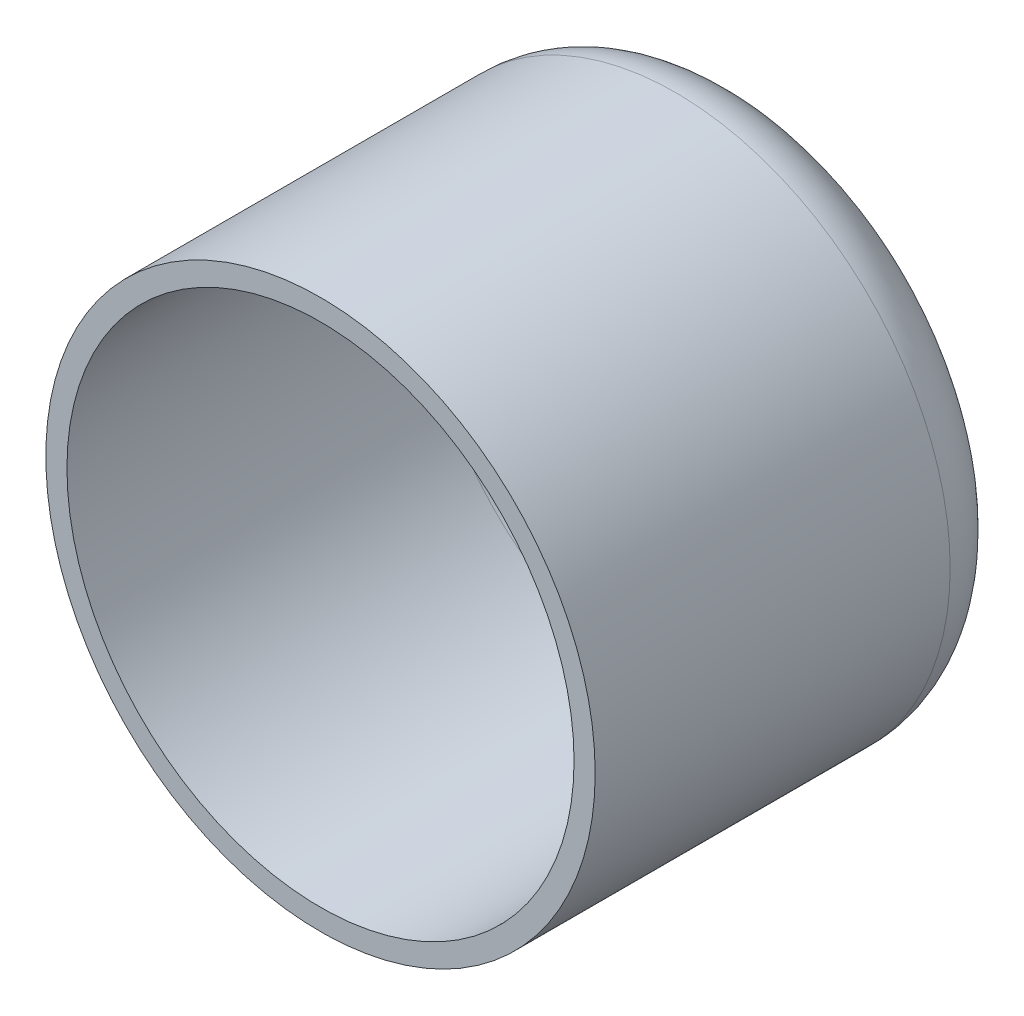
ISO-10303-21;
HEADER;
FILE_DESCRIPTION(('STEP AP214'),'2;1');
FILE_NAME('part.step','',(''),(''),'','','');
FILE_SCHEMA(('AUTOMOTIVE_DESIGN { 1 0 10303 214 1 1 1 1 }'));
ENDSEC;
DATA;
#1=APPLICATION_CONTEXT('core data for automotive mechanical design processes');
#2=APPLICATION_PROTOCOL_DEFINITION('international standard','automotive_design',2000,#1);
#3=PRODUCT_CONTEXT('',#1,'mechanical');
#4=PRODUCT('Part','Part','',(#3));
#5=PRODUCT_RELATED_PRODUCT_CATEGORY('part','',(#4));
#6=PRODUCT_DEFINITION_FORMATION('','',#4);
#7=PRODUCT_DEFINITION_CONTEXT('part definition',#1,'design');
#8=PRODUCT_DEFINITION('design','',#6,#7);
#9=PRODUCT_DEFINITION_SHAPE('','',#8);
#10=(LENGTH_UNIT() NAMED_UNIT(*) SI_UNIT(.MILLI.,.METRE.));
#11=(NAMED_UNIT(*) PLANE_ANGLE_UNIT() SI_UNIT($,.RADIAN.));
#12=(NAMED_UNIT(*) SI_UNIT($,.STERADIAN.) SOLID_ANGLE_UNIT());
#13=UNCERTAINTY_MEASURE_WITH_UNIT(LENGTH_MEASURE(1.E-05),#10,'distance_accuracy_value','');
#14=(GEOMETRIC_REPRESENTATION_CONTEXT(3) GLOBAL_UNCERTAINTY_ASSIGNED_CONTEXT((#13)) GLOBAL_UNIT_ASSIGNED_CONTEXT((#10,
#11,#12)) REPRESENTATION_CONTEXT('',''));
#15=CARTESIAN_POINT('',(0.,0.,0.));
#16=DIRECTION('',(0.,0.,1.));
#17=DIRECTION('',(1.,0.,0.));
#18=AXIS2_PLACEMENT_3D('',#15,#16,#17);
#19=CARTESIAN_POINT('',(0.,0.,15.875));
#20=DIRECTION('',(0.,0.,-1.));
#21=DIRECTION('',(-1.,0.,0.));
#22=AXIS2_PLACEMENT_3D('',#19,#20,#21);
#23=CYLINDRICAL_SURFACE('',#22,10.31875);
#24=CARTESIAN_POINT('',(0.,0.,2.54));
#25=DIRECTION('',(0.,0.,1.));
#26=DIRECTION('',(1.,0.,0.));
#27=AXIS2_PLACEMENT_3D('',#24,#25,#26);
#28=CIRCLE('',#27,10.31875);
#29=CARTESIAN_POINT('',(10.31875,0.,2.54));
#30=VERTEX_POINT('',#29);
#31=EDGE_CURVE('E38',#30,#30,#28,.T.);
#32=ORIENTED_EDGE('',*,*,#31,.T.);
#33=EDGE_LOOP('',(#32));
#34=FACE_BOUND('',#33,.T.);
#35=CARTESIAN_POINT('',(0.,0.,15.875));
#36=DIRECTION('',(0.,0.,1.));
#37=DIRECTION('',(1.,0.,0.));
#38=AXIS2_PLACEMENT_3D('',#35,#36,#37);
#39=CIRCLE('',#38,10.31875);
#40=CARTESIAN_POINT('',(10.31875,0.,15.875));
#41=VERTEX_POINT('',#40);
#42=EDGE_CURVE('E42',#41,#41,#39,.T.);
#43=ORIENTED_EDGE('',*,*,#42,.F.);
#44=EDGE_LOOP('',(#43));
#45=FACE_BOUND('',#44,.T.);
#46=ADVANCED_FACE('F31',(#34,#45),#23,.T.);
#47=CARTESIAN_POINT('',(0.,0.,15.875));
#48=DIRECTION('',(0.,0.,1.));
#49=DIRECTION('',(1.,0.,0.));
#50=AXIS2_PLACEMENT_3D('',#47,#48,#49);
#51=PLANE('',#50);
#52=CARTESIAN_POINT('',(0.,0.,15.875));
#53=DIRECTION('',(0.,0.,1.));
#54=DIRECTION('',(1.,0.,0.));
#55=AXIS2_PLACEMENT_3D('',#52,#53,#54);
#56=CIRCLE('',#55,9.525);
#57=CARTESIAN_POINT('',(9.525,0.,15.875));
#58=VERTEX_POINT('',#57);
#59=EDGE_CURVE('E49',#58,#58,#56,.T.);
#60=ORIENTED_EDGE('',*,*,#59,.F.);
#61=EDGE_LOOP('',(#60));
#62=FACE_BOUND('',#61,.T.);
#63=ORIENTED_EDGE('',*,*,#42,.T.);
#64=EDGE_LOOP('',(#63));
#65=FACE_BOUND('',#64,.T.);
#66=ADVANCED_FACE('F67',(#62,#65),#51,.T.);
#67=CARTESIAN_POINT('',(0.,0.,0.));
#68=DIRECTION('',(0.,0.,1.));
#69=DIRECTION('',(1.,0.,0.));
#70=AXIS2_PLACEMENT_3D('',#67,#68,#69);
#71=PLANE('',#70);
#72=CARTESIAN_POINT('',(0.,0.,0.));
#73=DIRECTION('',(0.,0.,1.));
#74=DIRECTION('',(1.,0.,0.));
#75=AXIS2_PLACEMENT_3D('',#72,#73,#74);
#76=CIRCLE('',#75,7.77875);
#77=CARTESIAN_POINT('',(7.77875,0.,0.));
#78=VERTEX_POINT('',#77);
#79=EDGE_CURVE('E10',#78,#78,#76,.F.);
#80=ORIENTED_EDGE('',*,*,#79,.T.);
#81=EDGE_LOOP('',(#80));
#82=FACE_BOUND('',#81,.T.);
#83=ADVANCED_FACE('F70',(#82),#71,.F.);
#84=CARTESIAN_POINT('',(0.,0.,2.54));
#85=DIRECTION('',(0.,0.,1.));
#86=DIRECTION('',(1.,0.,0.));
#87=AXIS2_PLACEMENT_3D('',#84,#85,#86);
#88=TOROIDAL_SURFACE('',#87,7.77875,2.54);
#89=ORIENTED_EDGE('',*,*,#79,.F.);
#90=EDGE_LOOP('',(#89));
#91=FACE_BOUND('',#90,.T.);
#92=ORIENTED_EDGE('',*,*,#31,.F.);
#93=EDGE_LOOP('',(#92));
#94=FACE_BOUND('',#93,.T.);
#95=ADVANCED_FACE('F33',(#91,#94),#88,.T.);
#96=CARTESIAN_POINT('',(0.,0.,15.875));
#97=DIRECTION('',(0.,0.,-1.));
#98=DIRECTION('',(-1.,0.,0.));
#99=AXIS2_PLACEMENT_3D('',#96,#97,#98);
#100=CYLINDRICAL_SURFACE('',#99,9.525);
#101=CARTESIAN_POINT('',(0.,0.,2.54));
#102=DIRECTION('',(0.,0.,-1.));
#103=DIRECTION('',(-1.,0.,0.));
#104=AXIS2_PLACEMENT_3D('',#101,#102,#103);
#105=CIRCLE('',#104,9.525);
#106=CARTESIAN_POINT('',(-9.525,0.,2.54));
#107=VERTEX_POINT('',#106);
#108=EDGE_CURVE('E52',#107,#107,#105,.F.);
#109=ORIENTED_EDGE('',*,*,#108,.F.);
#110=EDGE_LOOP('',(#109));
#111=FACE_BOUND('',#110,.T.);
#112=ORIENTED_EDGE('',*,*,#59,.T.);
#113=EDGE_LOOP('',(#112));
#114=FACE_BOUND('',#113,.T.);
#115=ADVANCED_FACE('F60',(#111,#114),#100,.F.);
#116=CARTESIAN_POINT('',(0.,0.,0.79375));
#117=DIRECTION('',(0.,0.,1.));
#118=DIRECTION('',(1.,0.,0.));
#119=AXIS2_PLACEMENT_3D('',#116,#117,#118);
#120=PLANE('',#119);
#121=CARTESIAN_POINT('',(0.,0.,0.79375));
#122=DIRECTION('',(0.,0.,1.));
#123=DIRECTION('',(1.,0.,0.));
#124=AXIS2_PLACEMENT_3D('',#121,#122,#123);
#125=CIRCLE('',#124,7.77875);
#126=CARTESIAN_POINT('',(7.77875,0.,0.79375));
#127=VERTEX_POINT('',#126);
#128=EDGE_CURVE('E46',#127,#127,#125,.F.);
#129=ORIENTED_EDGE('',*,*,#128,.F.);
#130=EDGE_LOOP('',(#129));
#131=FACE_BOUND('',#130,.T.);
#132=ADVANCED_FACE('F63',(#131),#120,.T.);
#133=CARTESIAN_POINT('',(0.,0.,2.54));
#134=DIRECTION('',(0.,0.,1.));
#135=DIRECTION('',(1.,0.,0.));
#136=AXIS2_PLACEMENT_3D('',#133,#134,#135);
#137=TOROIDAL_SURFACE('',#136,7.77875,1.74625);
#138=ORIENTED_EDGE('',*,*,#128,.T.);
#139=EDGE_LOOP('',(#138));
#140=FACE_BOUND('',#139,.T.);
#141=ORIENTED_EDGE('',*,*,#108,.T.);
#142=EDGE_LOOP('',(#141));
#143=FACE_BOUND('',#142,.T.);
#144=ADVANCED_FACE('F58',(#140,#143),#137,.F.);
#145=CLOSED_SHELL('',(#46,#66,#83,#95,#115,#132,#144));
#146=MANIFOLD_SOLID_BREP('B2',#145);
#147=ADVANCED_BREP_SHAPE_REPRESENTATION('',(#18,#146),#14);
#148=SHAPE_DEFINITION_REPRESENTATION(#9,#147);
ENDSEC;
END-ISO-10303-21;
